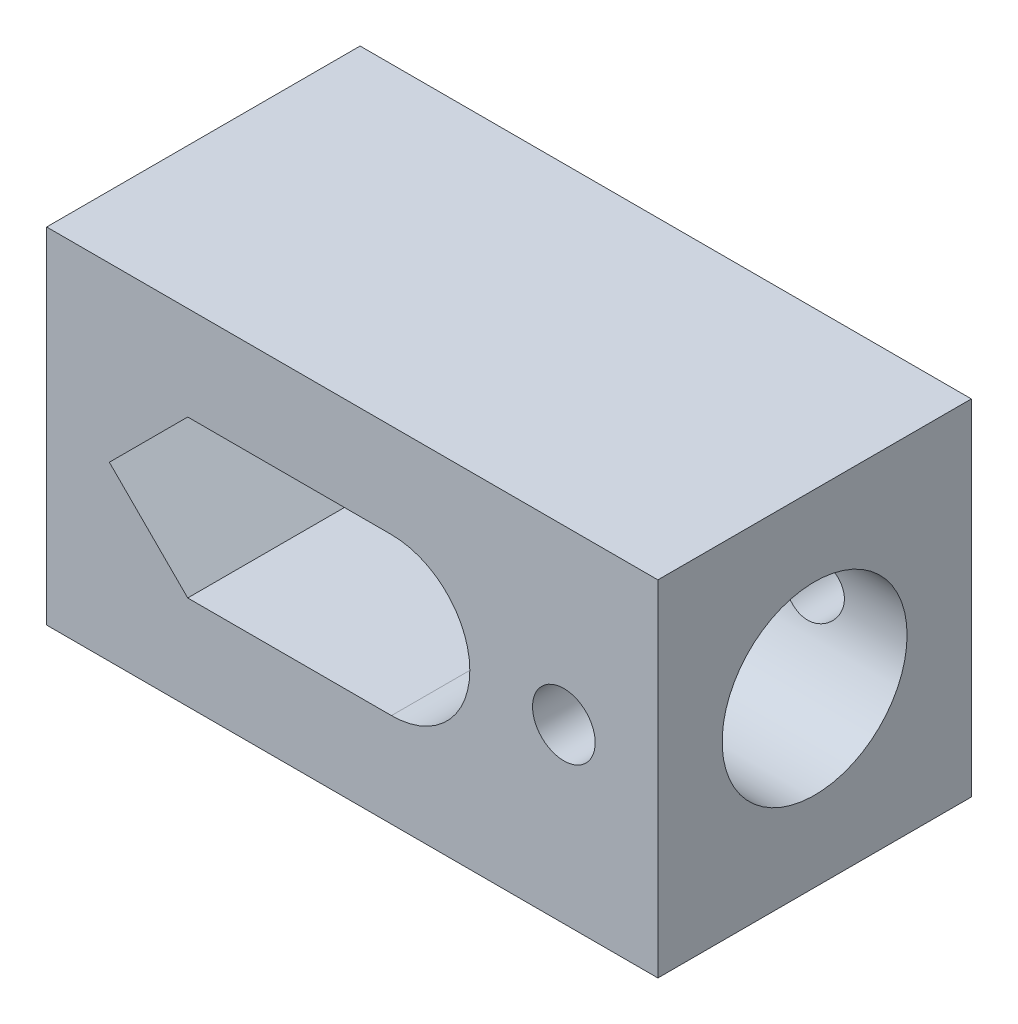
ISO-10303-21;
HEADER;
FILE_DESCRIPTION(('STEP AP214'),'2;1');
FILE_NAME('part.step','',(''),(''),'','','');
FILE_SCHEMA(('AUTOMOTIVE_DESIGN { 1 0 10303 214 1 1 1 1 }'));
ENDSEC;
DATA;
#1=APPLICATION_CONTEXT('core data for automotive mechanical design processes');
#2=APPLICATION_PROTOCOL_DEFINITION('international standard','automotive_design',2000,#1);
#3=PRODUCT_CONTEXT('',#1,'mechanical');
#4=PRODUCT('Part','Part','',(#3));
#5=PRODUCT_RELATED_PRODUCT_CATEGORY('part','',(#4));
#6=PRODUCT_DEFINITION_FORMATION('','',#4);
#7=PRODUCT_DEFINITION_CONTEXT('part definition',#1,'design');
#8=PRODUCT_DEFINITION('design','',#6,#7);
#9=PRODUCT_DEFINITION_SHAPE('','',#8);
#10=(LENGTH_UNIT() NAMED_UNIT(*) SI_UNIT(.MILLI.,.METRE.));
#11=(NAMED_UNIT(*) PLANE_ANGLE_UNIT() SI_UNIT($,.RADIAN.));
#12=(NAMED_UNIT(*) SI_UNIT($,.STERADIAN.) SOLID_ANGLE_UNIT());
#13=UNCERTAINTY_MEASURE_WITH_UNIT(LENGTH_MEASURE(1.E-05),#10,'distance_accuracy_value','');
#14=(GEOMETRIC_REPRESENTATION_CONTEXT(3) GLOBAL_UNCERTAINTY_ASSIGNED_CONTEXT((#13)) GLOBAL_UNIT_ASSIGNED_CONTEXT((#10,
#11,#12)) REPRESENTATION_CONTEXT('',''));
#15=CARTESIAN_POINT('',(0.,0.,0.));
#16=DIRECTION('',(0.,0.,1.));
#17=DIRECTION('',(1.,0.,0.));
#18=AXIS2_PLACEMENT_3D('',#15,#16,#17);
#19=CARTESIAN_POINT('',(0.,0.,5.));
#20=DIRECTION('',(0.,0.,1.));
#21=DIRECTION('',(1.,0.,0.));
#22=AXIS2_PLACEMENT_3D('',#19,#20,#21);
#23=PLANE('',#22);
#24=CARTESIAN_POINT('',(6.75,0.,5.));
#25=DIRECTION('',(0.,0.,1.));
#26=DIRECTION('',(1.,0.,0.));
#27=AXIS2_PLACEMENT_3D('',#24,#25,#26);
#28=CIRCLE('',#27,0.999999999999987);
#29=CARTESIAN_POINT('',(7.74999999999999,0.,5.));
#30=VERTEX_POINT('',#29);
#31=EDGE_CURVE('E355',#30,#30,#28,.T.);
#32=ORIENTED_EDGE('',*,*,#31,.F.);
#33=EDGE_LOOP('',(#32));
#34=FACE_BOUND('',#33,.T.);
#35=DIRECTION('',(0.,-1.,0.));
#36=VECTOR('',#35,1.);
#37=CARTESIAN_POINT('',(-9.75,-5.5,5.));
#38=LINE('',#37,#36);
#39=CARTESIAN_POINT('',(-9.75,5.5,5.));
#40=VERTEX_POINT('',#39);
#41=CARTESIAN_POINT('',(-9.75,-5.5,5.));
#42=VERTEX_POINT('',#41);
#43=EDGE_CURVE('E157',#40,#42,#38,.T.);
#44=ORIENTED_EDGE('',*,*,#43,.T.);
#45=DIRECTION('',(1.,0.,0.));
#46=VECTOR('',#45,1.);
#47=CARTESIAN_POINT('',(9.75,-5.5,5.));
#48=LINE('',#47,#46);
#49=CARTESIAN_POINT('',(9.75,-5.5,5.));
#50=VERTEX_POINT('',#49);
#51=EDGE_CURVE('E160',#42,#50,#48,.T.);
#52=ORIENTED_EDGE('',*,*,#51,.T.);
#53=DIRECTION('',(0.,1.,0.));
#54=VECTOR('',#53,1.);
#55=CARTESIAN_POINT('',(9.75,-5.5,5.));
#56=LINE('',#55,#54);
#57=CARTESIAN_POINT('',(9.75,5.5,5.));
#58=VERTEX_POINT('',#57);
#59=EDGE_CURVE('E163',#50,#58,#56,.T.);
#60=ORIENTED_EDGE('',*,*,#59,.T.);
#61=DIRECTION('',(-1.,0.,0.));
#62=VECTOR('',#61,1.);
#63=CARTESIAN_POINT('',(9.75,5.5,5.));
#64=LINE('',#63,#62);
#65=EDGE_CURVE('E165',#58,#40,#64,.T.);
#66=ORIENTED_EDGE('',*,*,#65,.T.);
#67=EDGE_LOOP('',(#44,#52,#60,#66));
#68=FACE_BOUND('',#67,.T.);
#69=DIRECTION('',(-1.,0.,0.));
#70=VECTOR('',#69,1.);
#71=CARTESIAN_POINT('',(-5.25,2.5,5.));
#72=LINE('',#71,#70);
#73=CARTESIAN_POINT('',(1.25,2.5,5.));
#74=VERTEX_POINT('',#73);
#75=CARTESIAN_POINT('',(-5.25,2.5,5.));
#76=VERTEX_POINT('',#75);
#77=EDGE_CURVE('E119',#74,#76,#72,.T.);
#78=ORIENTED_EDGE('',*,*,#77,.F.);
#79=CARTESIAN_POINT('',(1.25,0.,5.));
#80=DIRECTION('',(0.,0.,1.));
#81=DIRECTION('',(-1.,0.,0.));
#82=AXIS2_PLACEMENT_3D('',#79,#80,#81);
#83=CIRCLE('',#82,2.5);
#84=CARTESIAN_POINT('',(1.25,-2.5,5.));
#85=VERTEX_POINT('',#84);
#86=EDGE_CURVE('E111',#85,#74,#83,.T.);
#87=ORIENTED_EDGE('',*,*,#86,.F.);
#88=DIRECTION('',(1.,0.,0.));
#89=VECTOR('',#88,1.);
#90=CARTESIAN_POINT('',(-5.25,-2.5,5.));
#91=LINE('',#90,#89);
#92=CARTESIAN_POINT('',(-5.25,-2.5,5.));
#93=VERTEX_POINT('',#92);
#94=EDGE_CURVE('E139',#93,#85,#91,.T.);
#95=ORIENTED_EDGE('',*,*,#94,.F.);
#96=DIRECTION('',(0.707106781186548,-0.707106781186548,0.));
#97=VECTOR('',#96,1.);
#98=CARTESIAN_POINT('',(-7.75,0.,5.));
#99=LINE('',#98,#97);
#100=CARTESIAN_POINT('',(-7.75,0.,5.));
#101=VERTEX_POINT('',#100);
#102=EDGE_CURVE('E134',#101,#93,#99,.T.);
#103=ORIENTED_EDGE('',*,*,#102,.F.);
#104=DIRECTION('',(-0.707106781186548,-0.707106781186548,0.));
#105=VECTOR('',#104,1.);
#106=CARTESIAN_POINT('',(-5.25,2.5,5.));
#107=LINE('',#106,#105);
#108=EDGE_CURVE('E132',#76,#101,#107,.T.);
#109=ORIENTED_EDGE('',*,*,#108,.F.);
#110=EDGE_LOOP('',(#78,#87,#95,#103,#109));
#111=FACE_BOUND('',#110,.T.);
#112=ADVANCED_FACE('F34',(#34,#68,#111),#23,.T.);
#113=CARTESIAN_POINT('',(0.,0.,-5.));
#114=DIRECTION('',(0.,0.,1.));
#115=DIRECTION('',(1.,0.,0.));
#116=AXIS2_PLACEMENT_3D('',#113,#114,#115);
#117=PLANE('',#116);
#118=CARTESIAN_POINT('',(6.75,0.,-5.));
#119=DIRECTION('',(0.,0.,1.));
#120=DIRECTION('',(1.,0.,0.));
#121=AXIS2_PLACEMENT_3D('',#118,#119,#120);
#122=CIRCLE('',#121,0.999999999999997);
#123=CARTESIAN_POINT('',(7.75,0.,-5.));
#124=VERTEX_POINT('',#123);
#125=EDGE_CURVE('E185',#124,#124,#122,.T.);
#126=ORIENTED_EDGE('',*,*,#125,.T.);
#127=EDGE_LOOP('',(#126));
#128=FACE_BOUND('',#127,.T.);
#129=DIRECTION('',(0.,-1.,0.));
#130=VECTOR('',#129,1.);
#131=CARTESIAN_POINT('',(-9.75,-5.5,-5.));
#132=LINE('',#131,#130);
#133=CARTESIAN_POINT('',(-9.75,5.5,-5.));
#134=VERTEX_POINT('',#133);
#135=CARTESIAN_POINT('',(-9.75,-5.5,-5.));
#136=VERTEX_POINT('',#135);
#137=EDGE_CURVE('E127',#134,#136,#132,.T.);
#138=ORIENTED_EDGE('',*,*,#137,.F.);
#139=DIRECTION('',(-1.,0.,0.));
#140=VECTOR('',#139,1.);
#141=CARTESIAN_POINT('',(9.75,5.5,-5.));
#142=LINE('',#141,#140);
#143=CARTESIAN_POINT('',(9.75,5.5,-5.));
#144=VERTEX_POINT('',#143);
#145=EDGE_CURVE('E161',#144,#134,#142,.T.);
#146=ORIENTED_EDGE('',*,*,#145,.F.);
#147=DIRECTION('',(0.,1.,0.));
#148=VECTOR('',#147,1.);
#149=CARTESIAN_POINT('',(9.75,-5.5,-5.));
#150=LINE('',#149,#148);
#151=CARTESIAN_POINT('',(9.75,-5.5,-5.));
#152=VERTEX_POINT('',#151);
#153=EDGE_CURVE('E172',#152,#144,#150,.T.);
#154=ORIENTED_EDGE('',*,*,#153,.F.);
#155=DIRECTION('',(1.,0.,0.));
#156=VECTOR('',#155,1.);
#157=CARTESIAN_POINT('',(9.75,-5.5,-5.));
#158=LINE('',#157,#156);
#159=EDGE_CURVE('E170',#136,#152,#158,.T.);
#160=ORIENTED_EDGE('',*,*,#159,.F.);
#161=EDGE_LOOP('',(#138,#146,#154,#160));
#162=FACE_BOUND('',#161,.T.);
#163=CARTESIAN_POINT('',(1.25,0.,-5.));
#164=DIRECTION('',(0.,0.,1.));
#165=DIRECTION('',(-1.,0.,0.));
#166=AXIS2_PLACEMENT_3D('',#163,#164,#165);
#167=CIRCLE('',#166,2.5);
#168=CARTESIAN_POINT('',(1.25,-2.5,-5.));
#169=VERTEX_POINT('',#168);
#170=CARTESIAN_POINT('',(1.25,2.5,-5.));
#171=VERTEX_POINT('',#170);
#172=EDGE_CURVE('E63',#169,#171,#167,.T.);
#173=ORIENTED_EDGE('',*,*,#172,.T.);
#174=DIRECTION('',(-1.,0.,0.));
#175=VECTOR('',#174,1.);
#176=CARTESIAN_POINT('',(-5.25,2.5,-5.));
#177=LINE('',#176,#175);
#178=CARTESIAN_POINT('',(-5.25,2.5,-5.));
#179=VERTEX_POINT('',#178);
#180=EDGE_CURVE('E126',#171,#179,#177,.T.);
#181=ORIENTED_EDGE('',*,*,#180,.T.);
#182=DIRECTION('',(-0.707106781186548,-0.707106781186548,0.));
#183=VECTOR('',#182,1.);
#184=CARTESIAN_POINT('',(-5.25,2.5,-5.));
#185=LINE('',#184,#183);
#186=CARTESIAN_POINT('',(-7.75,0.,-5.));
#187=VERTEX_POINT('',#186);
#188=EDGE_CURVE('E144',#179,#187,#185,.T.);
#189=ORIENTED_EDGE('',*,*,#188,.T.);
#190=DIRECTION('',(0.707106781186548,-0.707106781186548,0.));
#191=VECTOR('',#190,1.);
#192=CARTESIAN_POINT('',(-7.75,0.,-5.));
#193=LINE('',#192,#191);
#194=CARTESIAN_POINT('',(-5.25,-2.5,-5.));
#195=VERTEX_POINT('',#194);
#196=EDGE_CURVE('E147',#187,#195,#193,.T.);
#197=ORIENTED_EDGE('',*,*,#196,.T.);
#198=DIRECTION('',(1.,0.,0.));
#199=VECTOR('',#198,1.);
#200=CARTESIAN_POINT('',(-5.25,-2.5,-5.));
#201=LINE('',#200,#199);
#202=EDGE_CURVE('E120',#195,#169,#201,.T.);
#203=ORIENTED_EDGE('',*,*,#202,.T.);
#204=EDGE_LOOP('',(#173,#181,#189,#197,#203));
#205=FACE_BOUND('',#204,.T.);
#206=ADVANCED_FACE('F208',(#128,#162,#205),#117,.F.);
#207=CARTESIAN_POINT('',(-9.75,-5.5,5.));
#208=DIRECTION('',(1.,0.,0.));
#209=DIRECTION('',(0.,0.,-1.));
#210=AXIS2_PLACEMENT_3D('',#207,#208,#209);
#211=PLANE('',#210);
#212=ORIENTED_EDGE('',*,*,#137,.T.);
#213=DIRECTION('',(0.,0.,-1.));
#214=VECTOR('',#213,1.);
#215=CARTESIAN_POINT('',(-9.75,-5.5,5.));
#216=LINE('',#215,#214);
#217=EDGE_CURVE('E11',#42,#136,#216,.T.);
#218=ORIENTED_EDGE('',*,*,#217,.F.);
#219=ORIENTED_EDGE('',*,*,#43,.F.);
#220=DIRECTION('',(0.,0.,-1.));
#221=VECTOR('',#220,1.);
#222=CARTESIAN_POINT('',(-9.75,5.5,5.));
#223=LINE('',#222,#221);
#224=EDGE_CURVE('E167',#40,#134,#223,.T.);
#225=ORIENTED_EDGE('',*,*,#224,.T.);
#226=EDGE_LOOP('',(#212,#218,#219,#225));
#227=FACE_BOUND('',#226,.T.);
#228=ADVANCED_FACE('F36',(#227),#211,.F.);
#229=CARTESIAN_POINT('',(9.75,-5.5,5.));
#230=DIRECTION('',(0.,1.,0.));
#231=DIRECTION('',(-1.,0.,0.));
#232=AXIS2_PLACEMENT_3D('',#229,#230,#231);
#233=PLANE('',#232);
#234=ORIENTED_EDGE('',*,*,#159,.T.);
#235=DIRECTION('',(0.,0.,-1.));
#236=VECTOR('',#235,1.);
#237=CARTESIAN_POINT('',(9.75,-5.5,5.));
#238=LINE('',#237,#236);
#239=EDGE_CURVE('E47',#50,#152,#238,.T.);
#240=ORIENTED_EDGE('',*,*,#239,.F.);
#241=ORIENTED_EDGE('',*,*,#51,.F.);
#242=ORIENTED_EDGE('',*,*,#217,.T.);
#243=EDGE_LOOP('',(#234,#240,#241,#242));
#244=FACE_BOUND('',#243,.T.);
#245=ADVANCED_FACE('F227',(#244),#233,.F.);
#246=CARTESIAN_POINT('',(9.75,-5.5,5.));
#247=DIRECTION('',(-1.,0.,0.));
#248=DIRECTION('',(0.,-1.,0.));
#249=AXIS2_PLACEMENT_3D('',#246,#247,#248);
#250=PLANE('',#249);
#251=CARTESIAN_POINT('',(9.75,0.,0.));
#252=DIRECTION('',(1.,0.,0.));
#253=DIRECTION('',(0.,0.,-1.));
#254=AXIS2_PLACEMENT_3D('',#251,#252,#253);
#255=CIRCLE('',#254,2.95);
#256=CARTESIAN_POINT('',(9.75,0.,-2.95));
#257=VERTEX_POINT('',#256);
#258=EDGE_CURVE('E348',#257,#257,#255,.T.);
#259=ORIENTED_EDGE('',*,*,#258,.F.);
#260=EDGE_LOOP('',(#259));
#261=FACE_BOUND('',#260,.T.);
#262=ORIENTED_EDGE('',*,*,#153,.T.);
#263=DIRECTION('',(0.,0.,-1.));
#264=VECTOR('',#263,1.);
#265=CARTESIAN_POINT('',(9.75,5.5,5.));
#266=LINE('',#265,#264);
#267=EDGE_CURVE('E177',#58,#144,#266,.T.);
#268=ORIENTED_EDGE('',*,*,#267,.F.);
#269=ORIENTED_EDGE('',*,*,#59,.F.);
#270=ORIENTED_EDGE('',*,*,#239,.T.);
#271=EDGE_LOOP('',(#262,#268,#269,#270));
#272=FACE_BOUND('',#271,.T.);
#273=ADVANCED_FACE('F224',(#261,#272),#250,.F.);
#274=CARTESIAN_POINT('',(9.75,5.5,5.));
#275=DIRECTION('',(0.,-1.,0.));
#276=DIRECTION('',(1.,0.,0.));
#277=AXIS2_PLACEMENT_3D('',#274,#275,#276);
#278=PLANE('',#277);
#279=ORIENTED_EDGE('',*,*,#145,.T.);
#280=ORIENTED_EDGE('',*,*,#224,.F.);
#281=ORIENTED_EDGE('',*,*,#65,.F.);
#282=ORIENTED_EDGE('',*,*,#267,.T.);
#283=EDGE_LOOP('',(#279,#280,#281,#282));
#284=FACE_BOUND('',#283,.T.);
#285=ADVANCED_FACE('F221',(#284),#278,.F.);
#286=CARTESIAN_POINT('',(1.25,0.,5.));
#287=DIRECTION('',(0.,0.,-1.));
#288=DIRECTION('',(-1.,0.,0.));
#289=AXIS2_PLACEMENT_3D('',#286,#287,#288);
#290=CYLINDRICAL_SURFACE('',#289,2.5);
#291=ORIENTED_EDGE('',*,*,#172,.F.);
#292=DIRECTION('',(0.,0.,-1.));
#293=VECTOR('',#292,1.);
#294=CARTESIAN_POINT('',(1.25,-2.5,5.));
#295=LINE('',#294,#293);
#296=EDGE_CURVE('E115',#85,#169,#295,.T.);
#297=ORIENTED_EDGE('',*,*,#296,.F.);
#298=ORIENTED_EDGE('',*,*,#86,.T.);
#299=DIRECTION('',(0.,0.,-1.));
#300=VECTOR('',#299,1.);
#301=CARTESIAN_POINT('',(1.25,2.5,5.));
#302=LINE('',#301,#300);
#303=EDGE_CURVE('E114',#74,#171,#302,.T.);
#304=ORIENTED_EDGE('',*,*,#303,.T.);
#305=EDGE_LOOP('',(#291,#297,#298,#304));
#306=FACE_BOUND('',#305,.T.);
#307=ADVANCED_FACE('F113',(#306),#290,.F.);
#308=CARTESIAN_POINT('',(-5.25,2.5,5.));
#309=DIRECTION('',(0.,-1.,0.));
#310=DIRECTION('',(0.,0.,-1.));
#311=AXIS2_PLACEMENT_3D('',#308,#309,#310);
#312=PLANE('',#311);
#313=ORIENTED_EDGE('',*,*,#180,.F.);
#314=ORIENTED_EDGE('',*,*,#303,.F.);
#315=ORIENTED_EDGE('',*,*,#77,.T.);
#316=DIRECTION('',(0.,0.,-1.));
#317=VECTOR('',#316,1.);
#318=CARTESIAN_POINT('',(-5.25,2.5,5.));
#319=LINE('',#318,#317);
#320=EDGE_CURVE('E128',#76,#179,#319,.T.);
#321=ORIENTED_EDGE('',*,*,#320,.T.);
#322=EDGE_LOOP('',(#313,#314,#315,#321));
#323=FACE_BOUND('',#322,.T.);
#324=ADVANCED_FACE('F123',(#323),#312,.T.);
#325=CARTESIAN_POINT('',(-5.25,2.5,5.));
#326=DIRECTION('',(0.707106781186548,-0.707106781186548,0.));
#327=DIRECTION('',(0.707106781186548,0.707106781186548,0.));
#328=AXIS2_PLACEMENT_3D('',#325,#326,#327);
#329=PLANE('',#328);
#330=ORIENTED_EDGE('',*,*,#188,.F.);
#331=ORIENTED_EDGE('',*,*,#320,.F.);
#332=ORIENTED_EDGE('',*,*,#108,.T.);
#333=DIRECTION('',(0.,0.,-1.));
#334=VECTOR('',#333,1.);
#335=CARTESIAN_POINT('',(-7.75,0.,5.));
#336=LINE('',#335,#334);
#337=EDGE_CURVE('E154',#101,#187,#336,.T.);
#338=ORIENTED_EDGE('',*,*,#337,.T.);
#339=EDGE_LOOP('',(#330,#331,#332,#338));
#340=FACE_BOUND('',#339,.T.);
#341=ADVANCED_FACE('F254',(#340),#329,.T.);
#342=CARTESIAN_POINT('',(-7.75,0.,5.));
#343=DIRECTION('',(0.707106781186548,0.707106781186548,0.));
#344=DIRECTION('',(-0.707106781186548,0.707106781186548,0.));
#345=AXIS2_PLACEMENT_3D('',#342,#343,#344);
#346=PLANE('',#345);
#347=ORIENTED_EDGE('',*,*,#196,.F.);
#348=ORIENTED_EDGE('',*,*,#337,.F.);
#349=ORIENTED_EDGE('',*,*,#102,.T.);
#350=DIRECTION('',(0.,0.,-1.));
#351=VECTOR('',#350,1.);
#352=CARTESIAN_POINT('',(-5.25,-2.5,5.));
#353=LINE('',#352,#351);
#354=EDGE_CURVE('E55',#93,#195,#353,.T.);
#355=ORIENTED_EDGE('',*,*,#354,.T.);
#356=EDGE_LOOP('',(#347,#348,#349,#355));
#357=FACE_BOUND('',#356,.T.);
#358=ADVANCED_FACE('F251',(#357),#346,.T.);
#359=CARTESIAN_POINT('',(-5.25,-2.5,5.));
#360=DIRECTION('',(0.,1.,0.));
#361=DIRECTION('',(-1.,0.,0.));
#362=AXIS2_PLACEMENT_3D('',#359,#360,#361);
#363=PLANE('',#362);
#364=ORIENTED_EDGE('',*,*,#202,.F.);
#365=ORIENTED_EDGE('',*,*,#354,.F.);
#366=ORIENTED_EDGE('',*,*,#94,.T.);
#367=ORIENTED_EDGE('',*,*,#296,.T.);
#368=EDGE_LOOP('',(#364,#365,#366,#367));
#369=FACE_BOUND('',#368,.T.);
#370=ADVANCED_FACE('F204',(#369),#363,.T.);
#371=CARTESIAN_POINT('',(4.75,0.,0.));
#372=DIRECTION('',(1.,0.,0.));
#373=DIRECTION('',(0.,0.,-1.));
#374=AXIS2_PLACEMENT_3D('',#371,#372,#373);
#375=CYLINDRICAL_SURFACE('',#374,2.95);
#376=CARTESIAN_POINT('',(5.75000000000001,0.,-2.95));
#377=CARTESIAN_POINT('',(5.74999955688808,0.05451059420072,-2.95000029145323));
#378=CARTESIAN_POINT('',(5.75447154348286,0.10901815960502,-2.94847528228185));
#379=CARTESIAN_POINT('',(5.77218434359286,0.216424634263978,-2.94254220100316));
#380=CARTESIAN_POINT('',(5.78542577271618,0.269323430311579,-2.93813392649313));
#381=CARTESIAN_POINT('',(5.82016920300602,0.371948437480397,-2.92691256858244));
#382=CARTESIAN_POINT('',(5.84165711335998,0.421679892567577,-2.92010358888568));
#383=CARTESIAN_POINT('',(5.89221881435876,0.516832633719901,-2.90477359776748));
#384=CARTESIAN_POINT('',(5.92129418022023,0.562253022099599,-2.89625223092528));
#385=CARTESIAN_POINT('',(5.98729396503338,0.649114506456158,-2.87805212517248));
#386=CARTESIAN_POINT('',(6.02444070989596,0.690380683942867,-2.86834498138472));
#387=CARTESIAN_POINT('',(6.1050562387697,0.766232300597825,-2.84902142411236));
#388=CARTESIAN_POINT('',(6.14852647542009,0.800816200444476,-2.8394050320173));
#389=CARTESIAN_POINT('',(6.24214698998682,0.86333442711642,-2.82103698115251));
#390=CARTESIAN_POINT('',(6.29245821520995,0.891038849022131,-2.81231980220229));
#391=CARTESIAN_POINT('',(6.39736900834498,0.937517979182626,-2.79717036428471));
#392=CARTESIAN_POINT('',(6.45196720994774,0.956295519186459,-2.79073738089826));
#393=CARTESIAN_POINT('',(6.56190930873762,0.983727158375589,-2.78118438099379));
#394=CARTESIAN_POINT('',(6.61716161611919,0.992709878628593,-2.77795716747215));
#395=CARTESIAN_POINT('',(6.7284761869425,1.00132430200658,-2.77486442926219));
#396=CARTESIAN_POINT('',(6.78453818407258,1.00095901276314,-2.77499782333068));
#397=CARTESIAN_POINT('',(6.89305309823395,0.991142426596301,-2.77851748109883));
#398=CARTESIAN_POINT('',(6.94555100541754,0.982123280106026,-2.7817490252933));
#399=CARTESIAN_POINT('',(7.04823897342347,0.955961201291606,-2.79084718738855));
#400=CARTESIAN_POINT('',(7.09842874821637,0.938817265083645,-2.79671413090967));
#401=CARTESIAN_POINT('',(7.19604432246129,0.896615470659456,-2.81052999703595));
#402=CARTESIAN_POINT('',(7.24341084066736,0.871431681072115,-2.81851167992763));
#403=CARTESIAN_POINT('',(7.3333807695826,0.813952497428967,-2.83564432870023));
#404=CARTESIAN_POINT('',(7.37598276147437,0.781654993453508,-2.84479564115325));
#405=CARTESIAN_POINT('',(7.4576382293526,0.708802410900535,-2.86384170465828));
#406=CARTESIAN_POINT('',(7.49637494263836,0.667895067787679,-2.87374988855844));
#407=CARTESIAN_POINT('',(7.56652261342512,0.580043724493481,-2.89276108171158));
#408=CARTESIAN_POINT('',(7.5979328194282,0.533099105819362,-2.90186400830793));
#409=CARTESIAN_POINT('',(7.65280259282682,0.433816526300879,-2.91836574353378));
#410=CARTESIAN_POINT('',(7.67617464611175,0.381426819797729,-2.92574552997507));
#411=CARTESIAN_POINT('',(7.71367471108985,0.273148927632295,-2.93783107442794));
#412=CARTESIAN_POINT('',(7.72780604852527,0.217262008563369,-2.94253779439834));
#413=CARTESIAN_POINT('',(7.74585623489291,0.106255730020244,-2.94858626021517));
#414=CARTESIAN_POINT('',(7.75020291186467,0.0512135225539963,-2.95006887300376));
#415=CARTESIAN_POINT('',(7.74978259914726,-0.0588264167007497,-2.94992621550637));
#416=CARTESIAN_POINT('',(7.74501720757883,-0.113824154596118,-2.94830149020105));
#417=CARTESIAN_POINT('',(7.72684501744714,-0.220484091349988,-2.94221974696513));
#418=CARTESIAN_POINT('',(7.71370309009534,-0.272196862531278,-2.93784959987832));
#419=CARTESIAN_POINT('',(7.67948429698803,-0.372660887428653,-2.92680371325276));
#420=CARTESIAN_POINT('',(7.65840641326924,-0.421411760283175,-2.92012767794154));
#421=CARTESIAN_POINT('',(7.60828961696203,-0.516024725809123,-2.90492292611899));
#422=CARTESIAN_POINT('',(7.57905257672608,-0.561774455970628,-2.89634937221122));
#423=CARTESIAN_POINT('',(7.51367890093544,-0.647856248499977,-2.87831889193654));
#424=CARTESIAN_POINT('',(7.4775400951662,-0.688186599966309,-2.86886168819079));
#425=CARTESIAN_POINT('',(7.39737795003875,-0.76426193545654,-2.84956437810693));
#426=CARTESIAN_POINT('',(7.35306354146887,-0.799701706965578,-2.83972720323154));
#427=CARTESIAN_POINT('',(7.25890706887669,-0.862682533128113,-2.82123372566444));
#428=CARTESIAN_POINT('',(7.20906491304944,-0.890223456570151,-2.81257744259031));
#429=CARTESIAN_POINT('',(7.10520481767531,-0.936512653561713,-2.79750590572115));
#430=CARTESIAN_POINT('',(7.0511928057947,-0.955273150279012,-2.79108753973357));
#431=CARTESIAN_POINT('',(6.94050684490155,-0.983342710747905,-2.78132383589306));
#432=CARTESIAN_POINT('',(6.88383416295824,-0.992656226534644,-2.77797705058134));
#433=CARTESIAN_POINT('',(6.77267284743585,-1.00121304121889,-2.77490377995049));
#434=CARTESIAN_POINT('',(6.7182279739196,-1.00096466168768,-2.774994545988));
#435=CARTESIAN_POINT('',(6.61019935980394,-0.991662453519258,-2.77833213287195));
#436=CARTESIAN_POINT('',(6.55661556476635,-0.982609183779354,-2.78157875339805));
#437=CARTESIAN_POINT('',(6.4529171050507,-0.956319110319573,-2.79072393876646));
#438=CARTESIAN_POINT('',(6.40275406709057,-0.939252370092518,-2.79656726385443));
#439=CARTESIAN_POINT('',(6.30596585831205,-0.897558955070578,-2.81022541613495));
#440=CARTESIAN_POINT('',(6.25934149233216,-0.872930566836278,-2.81804069009169));
#441=CARTESIAN_POINT('',(6.16868646136505,-0.815524784033984,-2.83519909106955));
#442=CARTESIAN_POINT('',(6.12486594359877,-0.782431417487255,-2.84459502582165));
#443=CARTESIAN_POINT('',(6.0432361995097,-0.709563253946499,-2.86364041951063));
#444=CARTESIAN_POINT('',(6.00542870592822,-0.66978653781309,-2.87328995059497));
#445=CARTESIAN_POINT('',(5.93533986329039,-0.58273181835492,-2.89222829691784));
#446=CARTESIAN_POINT('',(5.90334715017061,-0.535213861139574,-2.90148630083584));
#447=CARTESIAN_POINT('',(5.84783550388641,-0.435166420690435,-2.9181667911611));
#448=CARTESIAN_POINT('',(5.82431474646108,-0.382638019437329,-2.92558967261605));
#449=CARTESIAN_POINT('',(5.78719654375351,-0.275855804130919,-2.93754850740182));
#450=CARTESIAN_POINT('',(5.77329382530507,-0.221718263426613,-2.94217262446317));
#451=CARTESIAN_POINT('',(5.75469716260166,-0.111719073250949,-2.94839776770193));
#452=CARTESIAN_POINT('',(5.75000045406444,-0.0558579464385214,-2.94999970134285));
#453=CARTESIAN_POINT('',(5.75000000000001,0.,-2.95));
#454=B_SPLINE_CURVE_WITH_KNOTS('',3,(#376,#377,#378,#379,#380,#381,#382,#383,#384,#385,#386,
#387,#388,#389,#390,#391,#392,#393,#394,#395,#396,#397,#398,#399,#400,#401,#402,#403,#404,#405,
#406,#407,#408,#409,#410,#411,#412,#413,#414,#415,#416,#417,#418,#419,#420,#421,#422,#423,#424,
#425,#426,#427,#428,#429,#430,#431,#432,#433,#434,#435,#436,#437,#438,#439,#440,#441,#442,#443,
#444,#445,#446,#447,#448,#449,#450,#451,#452,#453),.UNSPECIFIED.,.T.,.F.,(4,2,2,2,2,2,2,2,2,2,2,
2,2,2,2,2,2,2,2,2,2,2,2,2,2,2,2,2,2,2,2,2,2,2,2,2,2,2,4),(0.,0.163326163829831,
0.326663794245682,0.489723562440056,0.652817210119766,0.821155186128147,0.989531894162831,
1.16294623953723,1.33630553835415,1.50365030097473,1.67094122271475,1.83029057834211,
1.98965962801298,2.15165868113473,2.31370584785112,2.48452175358548,2.65535517263153,
2.82799363774167,3.00056993586087,3.16544045199783,3.33028205496082,3.49015366619603,
3.65004579151895,3.81422094399398,3.97844780551213,4.15040529467118,4.3223656401311,
4.49408588355598,4.66572516352202,4.82825316593054,4.99077085242022,5.14998549601002,
5.3092362436653,5.47563018101015,5.64207198067556,5.81530911598361,5.98850892591583,
6.15592234094361,6.3232854791553),.UNSPECIFIED.);
#455=CARTESIAN_POINT('',(5.75000000000001,0.,-2.95));
#456=VERTEX_POINT('',#455);
#457=EDGE_CURVE('E38',#456,#456,#454,.T.);
#458=ORIENTED_EDGE('',*,*,#457,.T.);
#459=EDGE_LOOP('',(#458));
#460=FACE_BOUND('',#459,.T.);
#461=CARTESIAN_POINT('',(7.74999999999999,0.,2.95));
#462=CARTESIAN_POINT('',(7.75000044311192,0.0545105942007182,2.95000029145323));
#463=CARTESIAN_POINT('',(7.74552845651714,0.109018159605018,2.94847528228185));
#464=CARTESIAN_POINT('',(7.72781565640714,0.216424634263976,2.94254220100316));
#465=CARTESIAN_POINT('',(7.71457422728383,0.269323430311577,2.93813392649313));
#466=CARTESIAN_POINT('',(7.67983079699398,0.371948437480396,2.92691256858244));
#467=CARTESIAN_POINT('',(7.65834288664003,0.421679892567575,2.92010358888568));
#468=CARTESIAN_POINT('',(7.60778118564125,0.516832633719899,2.90477359776748));
#469=CARTESIAN_POINT('',(7.57870581977977,0.562253022099597,2.89625223092528));
#470=CARTESIAN_POINT('',(7.51270603496662,0.649114506456156,2.87805212517248));
#471=CARTESIAN_POINT('',(7.47555929010404,0.690380683942866,2.86834498138472));
#472=CARTESIAN_POINT('',(7.39494376123031,0.766232300597824,2.84902142411236));
#473=CARTESIAN_POINT('',(7.35147352457992,0.800816200444475,2.8394050320173));
#474=CARTESIAN_POINT('',(7.25785301001318,0.863334427116419,2.82103698115251));
#475=CARTESIAN_POINT('',(7.20754178479005,0.89103884902213,2.81231980220229));
#476=CARTESIAN_POINT('',(7.10263099165502,0.937517979182625,2.79717036428471));
#477=CARTESIAN_POINT('',(7.04803279005227,0.956295519186458,2.79073738089826));
#478=CARTESIAN_POINT('',(6.93809069126239,0.983727158375588,2.78118438099379));
#479=CARTESIAN_POINT('',(6.88283838388081,0.992709878628592,2.77795716747215));
#480=CARTESIAN_POINT('',(6.77152381305751,1.00132430200658,2.77486442926219));
#481=CARTESIAN_POINT('',(6.71546181592742,1.00095901276314,2.77499782333068));
#482=CARTESIAN_POINT('',(6.60694690176606,0.991142426596301,2.77851748109883));
#483=CARTESIAN_POINT('',(6.55444899458247,0.982123280106026,2.7817490252933));
#484=CARTESIAN_POINT('',(6.45176102657653,0.955961201291607,2.79084718738855));
#485=CARTESIAN_POINT('',(6.40157125178363,0.938817265083645,2.79671413090967));
#486=CARTESIAN_POINT('',(6.30395567753872,0.896615470659456,2.81052999703595));
#487=CARTESIAN_POINT('',(6.25658915933264,0.871431681072115,2.81851167992763));
#488=CARTESIAN_POINT('',(6.1666192304174,0.813952497428968,2.83564432870023));
#489=CARTESIAN_POINT('',(6.12401723852564,0.781654993453509,2.84479564115325));
#490=CARTESIAN_POINT('',(6.04236177064741,0.708802410900536,2.86384170465828));
#491=CARTESIAN_POINT('',(6.00362505736165,0.66789506778768,2.87374988855844));
#492=CARTESIAN_POINT('',(5.93347738657488,0.580043724493482,2.89276108171158));
#493=CARTESIAN_POINT('',(5.90206718057181,0.533099105819363,2.90186400830793));
#494=CARTESIAN_POINT('',(5.84719740717319,0.43381652630088,2.91836574353378));
#495=CARTESIAN_POINT('',(5.82382535388825,0.38142681979773,2.92574552997507));
#496=CARTESIAN_POINT('',(5.78632528891015,0.273148927632296,2.93783107442794));
#497=CARTESIAN_POINT('',(5.77219395147474,0.217262008563371,2.94253779439834));
#498=CARTESIAN_POINT('',(5.7541437651071,0.106255730020246,2.94858626021517));
#499=CARTESIAN_POINT('',(5.74979708813534,0.0512135225539981,2.95006887300377));
#500=CARTESIAN_POINT('',(5.75021740085274,-0.058826416700748,2.94992621550637));
#501=CARTESIAN_POINT('',(5.75498279242118,-0.113824154596117,2.94830149020105));
#502=CARTESIAN_POINT('',(5.77315498255286,-0.220484091349986,2.94221974696513));
#503=CARTESIAN_POINT('',(5.78629690990466,-0.272196862531276,2.93784959987832));
#504=CARTESIAN_POINT('',(5.82051570301198,-0.372660887428652,2.92680371325276));
#505=CARTESIAN_POINT('',(5.84159358673076,-0.421411760283173,2.92012767794154));
#506=CARTESIAN_POINT('',(5.89171038303797,-0.516024725809122,2.90492292611899));
#507=CARTESIAN_POINT('',(5.92094742327392,-0.561774455970626,2.89634937221122));
#508=CARTESIAN_POINT('',(5.98632109906456,-0.647856248499976,2.87831889193654));
#509=CARTESIAN_POINT('',(6.0224599048338,-0.688186599966308,2.86886168819079));
#510=CARTESIAN_POINT('',(6.10262204996126,-0.764261935456539,2.84956437810693));
#511=CARTESIAN_POINT('',(6.14693645853113,-0.799701706965578,2.83972720323154));
#512=CARTESIAN_POINT('',(6.24109293112332,-0.862682533128113,2.82123372566444));
#513=CARTESIAN_POINT('',(6.29093508695056,-0.89022345657015,2.81257744259031));
#514=CARTESIAN_POINT('',(6.3947951823247,-0.936512653561712,2.79750590572115));
#515=CARTESIAN_POINT('',(6.4488071942053,-0.955273150279012,2.79108753973357));
#516=CARTESIAN_POINT('',(6.55949315509845,-0.983342710747905,2.78132383589306));
#517=CARTESIAN_POINT('',(6.61616583704176,-0.992656226534644,2.77797705058134));
#518=CARTESIAN_POINT('',(6.72732715256415,-1.00121304121889,2.77490377995049));
#519=CARTESIAN_POINT('',(6.7817720260804,-1.00096466168768,2.774994545988));
#520=CARTESIAN_POINT('',(6.88980064019606,-0.991662453519258,2.77833213287195));
#521=CARTESIAN_POINT('',(6.94338443523365,-0.982609183779354,2.78157875339805));
#522=CARTESIAN_POINT('',(7.0470828949493,-0.956319110319573,2.79072393876646));
#523=CARTESIAN_POINT('',(7.09724593290943,-0.939252370092518,2.79656726385443));
#524=CARTESIAN_POINT('',(7.19403414168795,-0.897558955070579,2.81022541613495));
#525=CARTESIAN_POINT('',(7.24065850766784,-0.872930566836279,2.81804069009169));
#526=CARTESIAN_POINT('',(7.33131353863495,-0.815524784033986,2.83519909106955));
#527=CARTESIAN_POINT('',(7.37513405640123,-0.782431417487256,2.84459502582165));
#528=CARTESIAN_POINT('',(7.4567638004903,-0.709563253946501,2.86364041951063));
#529=CARTESIAN_POINT('',(7.49457129407178,-0.669786537813092,2.87328995059496));
#530=CARTESIAN_POINT('',(7.56466013670961,-0.582731818354922,2.89222829691784));
#531=CARTESIAN_POINT('',(7.5966528498294,-0.535213861139576,2.90148630083584));
#532=CARTESIAN_POINT('',(7.6521644961136,-0.435166420690438,2.9181667911611));
#533=CARTESIAN_POINT('',(7.67568525353892,-0.382638019437331,2.92558967261604));
#534=CARTESIAN_POINT('',(7.71280345624649,-0.27585580413092,2.93754850740182));
#535=CARTESIAN_POINT('',(7.72670617469493,-0.221718263426615,2.94217262446317));
#536=CARTESIAN_POINT('',(7.74530283739835,-0.11171907325095,2.94839776770193));
#537=CARTESIAN_POINT('',(7.74999954593556,-0.0558579464385233,2.94999970134285));
#538=CARTESIAN_POINT('',(7.74999999999999,0.,2.95));
#539=B_SPLINE_CURVE_WITH_KNOTS('',3,(#461,#462,#463,#464,#465,#466,#467,#468,#469,#470,#471,
#472,#473,#474,#475,#476,#477,#478,#479,#480,#481,#482,#483,#484,#485,#486,#487,#488,#489,#490,
#491,#492,#493,#494,#495,#496,#497,#498,#499,#500,#501,#502,#503,#504,#505,#506,#507,#508,#509,
#510,#511,#512,#513,#514,#515,#516,#517,#518,#519,#520,#521,#522,#523,#524,#525,#526,#527,#528,
#529,#530,#531,#532,#533,#534,#535,#536,#537,#538),.UNSPECIFIED.,.T.,.F.,(4,2,2,2,2,2,2,2,2,2,2,
2,2,2,2,2,2,2,2,2,2,2,2,2,2,2,2,2,2,2,2,2,2,2,2,2,2,2,4),(0.,0.163326163829831,
0.326663794245682,0.489723562440056,0.652817210119765,0.821155186128147,0.989531894162831,
1.16294623953723,1.33630553835415,1.50365030097473,1.67094122271475,1.83029057834211,
1.98965962801299,2.15165868113473,2.31370584785112,2.48452175358548,2.65535517263154,
2.82799363774167,3.00056993586087,3.16544045199783,3.33028205496082,3.49015366619603,
3.65004579151895,3.81422094399398,3.97844780551213,4.15040529467118,4.3223656401311,
4.49408588355598,4.66572516352202,4.82825316593054,4.99077085242022,5.14998549601001,
5.3092362436653,5.47563018101015,5.64207198067556,5.81530911598361,5.98850892591583,
6.15592234094361,6.3232854791553),.UNSPECIFIED.);
#540=CARTESIAN_POINT('',(7.74999999999999,0.,2.95));
#541=VERTEX_POINT('',#540);
#542=EDGE_CURVE('E181',#541,#541,#539,.T.);
#543=ORIENTED_EDGE('',*,*,#542,.T.);
#544=EDGE_LOOP('',(#543));
#545=FACE_BOUND('',#544,.T.);
#546=CARTESIAN_POINT('',(4.75,0.,0.));
#547=DIRECTION('',(1.,0.,0.));
#548=DIRECTION('',(0.,0.,-1.));
#549=AXIS2_PLACEMENT_3D('',#546,#547,#548);
#550=CIRCLE('',#549,2.95);
#551=CARTESIAN_POINT('',(4.75,0.,-2.95));
#552=VERTEX_POINT('',#551);
#553=EDGE_CURVE('E142',#552,#552,#550,.T.);
#554=ORIENTED_EDGE('',*,*,#553,.F.);
#555=EDGE_LOOP('',(#554));
#556=FACE_BOUND('',#555,.T.);
#557=ORIENTED_EDGE('',*,*,#258,.T.);
#558=EDGE_LOOP('',(#557));
#559=FACE_BOUND('',#558,.T.);
#560=ADVANCED_FACE('F186',(#460,#545,#556,#559),#375,.F.);
#561=CARTESIAN_POINT('',(4.75,0.,0.));
#562=DIRECTION('',(1.,0.,0.));
#563=DIRECTION('',(0.,0.,-1.));
#564=AXIS2_PLACEMENT_3D('',#561,#562,#563);
#565=PLANE('',#564);
#566=ORIENTED_EDGE('',*,*,#553,.T.);
#567=EDGE_LOOP('',(#566));
#568=FACE_BOUND('',#567,.T.);
#569=ADVANCED_FACE('F195',(#568),#565,.T.);
#570=CARTESIAN_POINT('',(6.75,0.,5.));
#571=DIRECTION('',(0.,0.,1.));
#572=DIRECTION('',(1.,0.,0.));
#573=AXIS2_PLACEMENT_3D('',#570,#571,#572);
#574=CYLINDRICAL_SURFACE('',#573,0.999999999999992);
#575=ORIENTED_EDGE('',*,*,#31,.T.);
#576=EDGE_LOOP('',(#575));
#577=FACE_BOUND('',#576,.T.);
#578=ORIENTED_EDGE('',*,*,#542,.F.);
#579=EDGE_LOOP('',(#578));
#580=FACE_BOUND('',#579,.T.);
#581=ADVANCED_FACE('F193',(#577,#580),#574,.F.);
#582=ORIENTED_EDGE('',*,*,#125,.F.);
#583=EDGE_LOOP('',(#582));
#584=FACE_BOUND('',#583,.T.);
#585=ORIENTED_EDGE('',*,*,#457,.F.);
#586=EDGE_LOOP('',(#585));
#587=FACE_BOUND('',#586,.T.);
#588=ADVANCED_FACE('F190',(#584,#587),#574,.F.);
#589=CLOSED_SHELL('',(#112,#206,#228,#245,#273,#285,#307,#324,#341,#358,#370,#560,#569,#581,#588));
#590=MANIFOLD_SOLID_BREP('B2',#589);
#591=ADVANCED_BREP_SHAPE_REPRESENTATION('',(#18,#590),#14);
#592=SHAPE_DEFINITION_REPRESENTATION(#9,#591);
ENDSEC;
END-ISO-10303-21;
